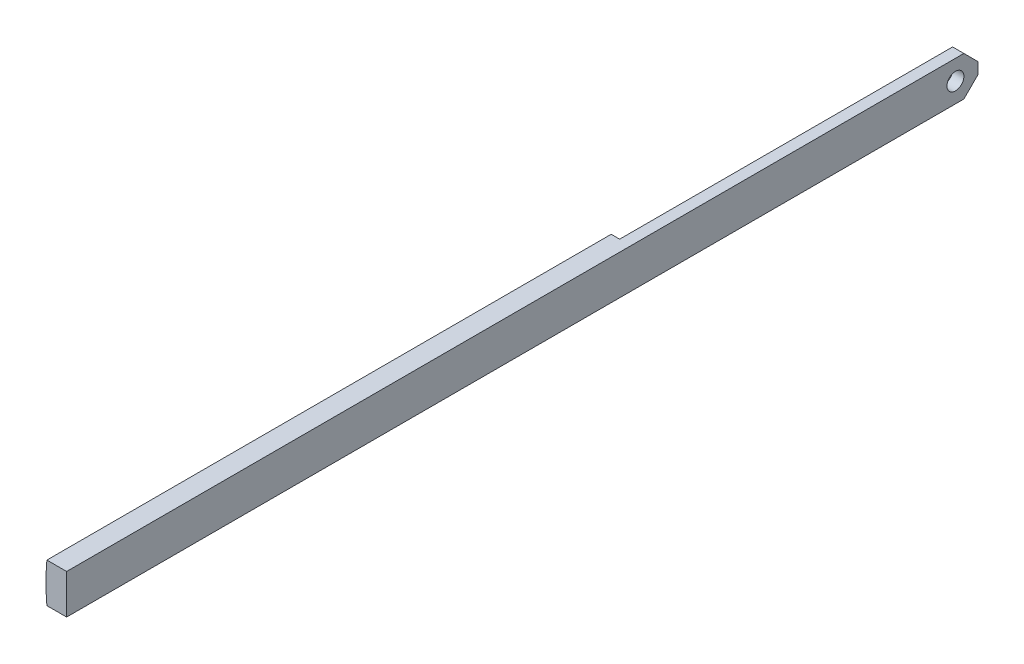
ISO-10303-21;
HEADER;
FILE_DESCRIPTION(('STEP AP214'),'2;1');
FILE_NAME('part.step','',(''),(''),'','','');
FILE_SCHEMA(('AUTOMOTIVE_DESIGN { 1 0 10303 214 1 1 1 1 }'));
ENDSEC;
DATA;
#1=APPLICATION_CONTEXT('core data for automotive mechanical design processes');
#2=APPLICATION_PROTOCOL_DEFINITION('international standard','automotive_design',2000,#1);
#3=PRODUCT_CONTEXT('',#1,'mechanical');
#4=PRODUCT('Part','Part','',(#3));
#5=PRODUCT_RELATED_PRODUCT_CATEGORY('part','',(#4));
#6=PRODUCT_DEFINITION_FORMATION('','',#4);
#7=PRODUCT_DEFINITION_CONTEXT('part definition',#1,'design');
#8=PRODUCT_DEFINITION('design','',#6,#7);
#9=PRODUCT_DEFINITION_SHAPE('','',#8);
#10=(LENGTH_UNIT() NAMED_UNIT(*) SI_UNIT(.MILLI.,.METRE.));
#11=(NAMED_UNIT(*) PLANE_ANGLE_UNIT() SI_UNIT($,.RADIAN.));
#12=(NAMED_UNIT(*) SI_UNIT($,.STERADIAN.) SOLID_ANGLE_UNIT());
#13=UNCERTAINTY_MEASURE_WITH_UNIT(LENGTH_MEASURE(1.E-05),#10,'distance_accuracy_value','');
#14=(GEOMETRIC_REPRESENTATION_CONTEXT(3) GLOBAL_UNCERTAINTY_ASSIGNED_CONTEXT((#13)) GLOBAL_UNIT_ASSIGNED_CONTEXT((#10,
#11,#12)) REPRESENTATION_CONTEXT('',''));
#15=CARTESIAN_POINT('',(0.,0.,0.));
#16=DIRECTION('',(0.,0.,1.));
#17=DIRECTION('',(1.,0.,0.));
#18=AXIS2_PLACEMENT_3D('',#15,#16,#17);
#19=CARTESIAN_POINT('',(72.6491205974634,4.39312657563779,0.));
#20=DIRECTION('',(0.,0.,1.));
#21=DIRECTION('',(1.,0.,0.));
#22=AXIS2_PLACEMENT_3D('',#19,#20,#21);
#23=PLANE('',#22);
#24=DIRECTION('',(0.,1.,0.));
#25=VECTOR('',#24,1.);
#26=CARTESIAN_POINT('',(6.,11.3931265756376,0.));
#27=LINE('',#26,#25);
#28=CARTESIAN_POINT('',(6.,-2.60687342436238,0.));
#29=VERTEX_POINT('',#28);
#30=CARTESIAN_POINT('',(6.,11.3931265756376,0.));
#31=VERTEX_POINT('',#30);
#32=EDGE_CURVE('E127',#29,#31,#27,.T.);
#33=ORIENTED_EDGE('',*,*,#32,.F.);
#34=DIRECTION('',(1.,0.,0.));
#35=VECTOR('',#34,1.);
#36=CARTESIAN_POINT('',(10.,-2.60687342436238,0.));
#37=LINE('',#36,#35);
#38=CARTESIAN_POINT('',(3.00000000000003,-2.60687342436238,0.));
#39=VERTEX_POINT('',#38);
#40=EDGE_CURVE('E132',#39,#29,#37,.T.);
#41=ORIENTED_EDGE('',*,*,#40,.F.);
#42=CARTESIAN_POINT('',(72.6491205974634,4.39312657563779,0.));
#43=DIRECTION('',(0.,0.,1.));
#44=DIRECTION('',(1.,0.,0.));
#45=AXIS2_PLACEMENT_3D('',#42,#43,#44);
#46=CIRCLE('',#45,70.);
#47=CARTESIAN_POINT('',(3.,11.3931265756376,0.));
#48=VERTEX_POINT('',#47);
#49=EDGE_CURVE('E130',#48,#39,#46,.T.);
#50=ORIENTED_EDGE('',*,*,#49,.F.);
#51=DIRECTION('',(-1.,0.,0.));
#52=VECTOR('',#51,1.);
#53=CARTESIAN_POINT('',(3.,11.3931265756376,0.));
#54=LINE('',#53,#52);
#55=EDGE_CURVE('E115',#31,#48,#54,.T.);
#56=ORIENTED_EDGE('',*,*,#55,.F.);
#57=EDGE_LOOP('',(#33,#41,#50,#56));
#58=FACE_BOUND('',#57,.T.);
#59=ADVANCED_FACE('F45',(#58),#23,.F.);
#60=CARTESIAN_POINT('',(72.6491205974634,4.39312657563779,200.));
#61=DIRECTION('',(0.,0.,-1.));
#62=DIRECTION('',(-1.,0.,0.));
#63=AXIS2_PLACEMENT_3D('',#60,#61,#62);
#64=CYLINDRICAL_SURFACE('',#63,70.);
#65=ORIENTED_EDGE('',*,*,#49,.T.);
#66=DIRECTION('',(0.,0.,-1.));
#67=VECTOR('',#66,1.);
#68=CARTESIAN_POINT('',(3.00000000000003,-2.60687342436238,200.));
#69=LINE('',#68,#67);
#70=CARTESIAN_POINT('',(3.00000000000003,-2.60687342436238,200.));
#71=VERTEX_POINT('',#70);
#72=EDGE_CURVE('E164',#71,#39,#69,.T.);
#73=ORIENTED_EDGE('',*,*,#72,.F.);
#74=CARTESIAN_POINT('',(72.6491205974634,4.39312657563779,200.));
#75=DIRECTION('',(0.,0.,1.));
#76=DIRECTION('',(1.,0.,0.));
#77=AXIS2_PLACEMENT_3D('',#74,#75,#76);
#78=CIRCLE('',#77,70.);
#79=CARTESIAN_POINT('',(3.,11.3931265756376,200.));
#80=VERTEX_POINT('',#79);
#81=EDGE_CURVE('E131',#80,#71,#78,.T.);
#82=ORIENTED_EDGE('',*,*,#81,.F.);
#83=DIRECTION('',(0.,0.,-1.));
#84=VECTOR('',#83,1.);
#85=CARTESIAN_POINT('',(3.,11.3931265756376,200.));
#86=LINE('',#85,#84);
#87=EDGE_CURVE('E155',#80,#48,#86,.T.);
#88=ORIENTED_EDGE('',*,*,#87,.T.);
#89=EDGE_LOOP('',(#65,#73,#82,#88));
#90=FACE_BOUND('',#89,.T.);
#91=ADVANCED_FACE('F192',(#90),#64,.T.);
#92=CARTESIAN_POINT('',(10.,-2.60687342436238,200.));
#93=DIRECTION('',(0.,1.,0.));
#94=DIRECTION('',(-1.,0.,0.));
#95=AXIS2_PLACEMENT_3D('',#92,#93,#94);
#96=PLANE('',#95);
#97=DIRECTION('',(0.,0.,1.));
#98=VECTOR('',#97,1.);
#99=CARTESIAN_POINT('',(6.,-2.60687342436238,-123.));
#100=LINE('',#99,#98);
#101=CARTESIAN_POINT('',(6.,-2.60687342436238,-118.));
#102=VERTEX_POINT('',#101);
#103=EDGE_CURVE('E121',#102,#29,#100,.T.);
#104=ORIENTED_EDGE('',*,*,#103,.F.);
#105=DIRECTION('',(1.,0.,0.));
#106=VECTOR('',#105,1.);
#107=CARTESIAN_POINT('',(10.,-2.60687342436238,-118.));
#108=LINE('',#107,#106);
#109=CARTESIAN_POINT('',(10.,-2.60687342436238,-118.));
#110=VERTEX_POINT('',#109);
#111=EDGE_CURVE('E68',#102,#110,#108,.T.);
#112=ORIENTED_EDGE('',*,*,#111,.T.);
#113=DIRECTION('',(0.,0.,-1.));
#114=VECTOR('',#113,1.);
#115=CARTESIAN_POINT('',(10.,-2.60687342436238,200.));
#116=LINE('',#115,#114);
#117=CARTESIAN_POINT('',(10.,-2.60687342436238,200.));
#118=VERTEX_POINT('',#117);
#119=EDGE_CURVE('E162',#118,#110,#116,.T.);
#120=ORIENTED_EDGE('',*,*,#119,.F.);
#121=DIRECTION('',(1.,0.,0.));
#122=VECTOR('',#121,1.);
#123=CARTESIAN_POINT('',(10.,-2.60687342436238,200.));
#124=LINE('',#123,#122);
#125=EDGE_CURVE('E149',#71,#118,#124,.T.);
#126=ORIENTED_EDGE('',*,*,#125,.F.);
#127=ORIENTED_EDGE('',*,*,#72,.T.);
#128=ORIENTED_EDGE('',*,*,#40,.T.);
#129=EDGE_LOOP('',(#104,#112,#120,#126,#127,#128));
#130=FACE_BOUND('',#129,.T.);
#131=ADVANCED_FACE('F188',(#130),#96,.F.);
#132=CARTESIAN_POINT('',(10.,11.3931265756376,200.));
#133=DIRECTION('',(-1.,0.,0.));
#134=DIRECTION('',(0.,0.,1.));
#135=AXIS2_PLACEMENT_3D('',#132,#133,#134);
#136=PLANE('',#135);
#137=CARTESIAN_POINT('',(10.,4.39312657563762,-115.));
#138=DIRECTION('',(1.,0.,0.));
#139=DIRECTION('',(0.,1.,0.));
#140=AXIS2_PLACEMENT_3D('',#137,#138,#139);
#141=CIRCLE('',#140,3.00000000000001);
#142=CARTESIAN_POINT('',(10.,7.39312657563763,-115.));
#143=VERTEX_POINT('',#142);
#144=EDGE_CURVE('E142',#143,#143,#141,.T.);
#145=ORIENTED_EDGE('',*,*,#144,.F.);
#146=EDGE_LOOP('',(#145));
#147=FACE_BOUND('',#146,.T.);
#148=ORIENTED_EDGE('',*,*,#119,.T.);
#149=DIRECTION('',(0.,0.707106781186548,-0.707106781186547));
#150=VECTOR('',#149,1.);
#151=CARTESIAN_POINT('',(10.,2.39312657563765,-123.));
#152=LINE('',#151,#150);
#153=CARTESIAN_POINT('',(9.99999999999999,2.39312657563765,-123.));
#154=VERTEX_POINT('',#153);
#155=EDGE_CURVE('E53',#110,#154,#152,.T.);
#156=ORIENTED_EDGE('',*,*,#155,.T.);
#157=DIRECTION('',(0.,-1.,0.));
#158=VECTOR('',#157,1.);
#159=CARTESIAN_POINT('',(9.99999999999999,11.3931265756376,-123.));
#160=LINE('',#159,#158);
#161=CARTESIAN_POINT('',(9.99999999999999,6.39312657563759,-123.));
#162=VERTEX_POINT('',#161);
#163=EDGE_CURVE('E136',#162,#154,#160,.T.);
#164=ORIENTED_EDGE('',*,*,#163,.F.);
#165=DIRECTION('',(0.,0.707106781186548,0.707106781186548));
#166=VECTOR('',#165,1.);
#167=CARTESIAN_POINT('',(10.,6.39312657563759,-123.));
#168=LINE('',#167,#166);
#169=CARTESIAN_POINT('',(10.,11.3931265756376,-118.));
#170=VERTEX_POINT('',#169);
#171=EDGE_CURVE('E60',#162,#170,#168,.T.);
#172=ORIENTED_EDGE('',*,*,#171,.T.);
#173=DIRECTION('',(0.,0.,-1.));
#174=VECTOR('',#173,1.);
#175=CARTESIAN_POINT('',(10.,11.3931265756376,200.));
#176=LINE('',#175,#174);
#177=CARTESIAN_POINT('',(10.,11.3931265756376,200.));
#178=VERTEX_POINT('',#177);
#179=EDGE_CURVE('E158',#178,#170,#176,.T.);
#180=ORIENTED_EDGE('',*,*,#179,.F.);
#181=DIRECTION('',(0.,1.,0.));
#182=VECTOR('',#181,1.);
#183=CARTESIAN_POINT('',(10.,11.3931265756376,200.));
#184=LINE('',#183,#182);
#185=EDGE_CURVE('E151',#118,#178,#184,.T.);
#186=ORIENTED_EDGE('',*,*,#185,.F.);
#187=EDGE_LOOP('',(#148,#156,#164,#172,#180,#186));
#188=FACE_BOUND('',#187,.T.);
#189=ADVANCED_FACE('F179',(#147,#188),#136,.F.);
#190=CARTESIAN_POINT('',(3.,11.3931265756376,200.));
#191=DIRECTION('',(0.,-1.,0.));
#192=DIRECTION('',(0.,0.,-1.));
#193=AXIS2_PLACEMENT_3D('',#190,#191,#192);
#194=PLANE('',#193);
#195=ORIENTED_EDGE('',*,*,#179,.T.);
#196=DIRECTION('',(-1.,0.,0.));
#197=VECTOR('',#196,1.);
#198=CARTESIAN_POINT('',(6.,11.3931265756376,-118.));
#199=LINE('',#198,#197);
#200=CARTESIAN_POINT('',(6.,11.3931265756376,-118.));
#201=VERTEX_POINT('',#200);
#202=EDGE_CURVE('E12',#170,#201,#199,.T.);
#203=ORIENTED_EDGE('',*,*,#202,.T.);
#204=DIRECTION('',(0.,0.,1.));
#205=VECTOR('',#204,1.);
#206=CARTESIAN_POINT('',(6.,11.3931265756376,-123.));
#207=LINE('',#206,#205);
#208=EDGE_CURVE('E111',#201,#31,#207,.T.);
#209=ORIENTED_EDGE('',*,*,#208,.T.);
#210=ORIENTED_EDGE('',*,*,#55,.T.);
#211=ORIENTED_EDGE('',*,*,#87,.F.);
#212=DIRECTION('',(-1.,0.,0.));
#213=VECTOR('',#212,1.);
#214=CARTESIAN_POINT('',(3.,11.3931265756376,200.));
#215=LINE('',#214,#213);
#216=EDGE_CURVE('E153',#178,#80,#215,.T.);
#217=ORIENTED_EDGE('',*,*,#216,.F.);
#218=EDGE_LOOP('',(#195,#203,#209,#210,#211,#217));
#219=FACE_BOUND('',#218,.T.);
#220=ADVANCED_FACE('F113',(#219),#194,.F.);
#221=CARTESIAN_POINT('',(72.6491205974634,4.39312657563779,200.));
#222=DIRECTION('',(0.,0.,1.));
#223=DIRECTION('',(1.,0.,0.));
#224=AXIS2_PLACEMENT_3D('',#221,#222,#223);
#225=PLANE('',#224);
#226=ORIENTED_EDGE('',*,*,#81,.T.);
#227=ORIENTED_EDGE('',*,*,#125,.T.);
#228=ORIENTED_EDGE('',*,*,#185,.T.);
#229=ORIENTED_EDGE('',*,*,#216,.T.);
#230=EDGE_LOOP('',(#226,#227,#228,#229));
#231=FACE_BOUND('',#230,.T.);
#232=ADVANCED_FACE('F195',(#231),#225,.T.);
#233=CARTESIAN_POINT('',(6.,11.3931265756376,-123.));
#234=DIRECTION('',(1.,0.,0.));
#235=DIRECTION('',(0.,1.,0.));
#236=AXIS2_PLACEMENT_3D('',#233,#234,#235);
#237=PLANE('',#236);
#238=CARTESIAN_POINT('',(6.,4.39312657563762,-115.));
#239=DIRECTION('',(1.,0.,0.));
#240=DIRECTION('',(0.,1.,0.));
#241=AXIS2_PLACEMENT_3D('',#238,#239,#240);
#242=CIRCLE('',#241,3.00000000000001);
#243=CARTESIAN_POINT('',(6.,7.39312657563763,-115.));
#244=VERTEX_POINT('',#243);
#245=EDGE_CURVE('E137',#244,#244,#242,.T.);
#246=ORIENTED_EDGE('',*,*,#245,.T.);
#247=EDGE_LOOP('',(#246));
#248=FACE_BOUND('',#247,.T.);
#249=DIRECTION('',(0.,1.,0.));
#250=VECTOR('',#249,1.);
#251=CARTESIAN_POINT('',(6.,11.3931265756376,-123.));
#252=LINE('',#251,#250);
#253=CARTESIAN_POINT('',(6.,2.39312657563765,-123.));
#254=VERTEX_POINT('',#253);
#255=CARTESIAN_POINT('',(6.,6.39312657563759,-123.));
#256=VERTEX_POINT('',#255);
#257=EDGE_CURVE('E122',#254,#256,#252,.T.);
#258=ORIENTED_EDGE('',*,*,#257,.F.);
#259=DIRECTION('',(0.,-0.707106781186548,0.707106781186547));
#260=VECTOR('',#259,1.);
#261=CARTESIAN_POINT('',(6.,2.39312657563765,-123.));
#262=LINE('',#261,#260);
#263=EDGE_CURVE('E175',#254,#102,#262,.T.);
#264=ORIENTED_EDGE('',*,*,#263,.T.);
#265=ORIENTED_EDGE('',*,*,#103,.T.);
#266=ORIENTED_EDGE('',*,*,#32,.T.);
#267=ORIENTED_EDGE('',*,*,#208,.F.);
#268=DIRECTION('',(0.,-0.707106781186548,-0.707106781186548));
#269=VECTOR('',#268,1.);
#270=CARTESIAN_POINT('',(6.,6.39312657563759,-123.));
#271=LINE('',#270,#269);
#272=EDGE_CURVE('E173',#201,#256,#271,.T.);
#273=ORIENTED_EDGE('',*,*,#272,.T.);
#274=EDGE_LOOP('',(#258,#264,#265,#266,#267,#273));
#275=FACE_BOUND('',#274,.T.);
#276=ADVANCED_FACE('F135',(#248,#275),#237,.F.);
#277=CARTESIAN_POINT('',(0.,0.,-123.));
#278=DIRECTION('',(0.,0.,-1.));
#279=DIRECTION('',(-1.,0.,0.));
#280=AXIS2_PLACEMENT_3D('',#277,#278,#279);
#281=PLANE('',#280);
#282=ORIENTED_EDGE('',*,*,#163,.T.);
#283=DIRECTION('',(-1.,0.,0.));
#284=VECTOR('',#283,1.);
#285=CARTESIAN_POINT('',(6.,2.39312657563765,-123.));
#286=LINE('',#285,#284);
#287=EDGE_CURVE('E170',#154,#254,#286,.T.);
#288=ORIENTED_EDGE('',*,*,#287,.T.);
#289=ORIENTED_EDGE('',*,*,#257,.T.);
#290=DIRECTION('',(1.,0.,0.));
#291=VECTOR('',#290,1.);
#292=CARTESIAN_POINT('',(9.99999999999999,6.39312657563759,-123.));
#293=LINE('',#292,#291);
#294=EDGE_CURVE('E166',#256,#162,#293,.T.);
#295=ORIENTED_EDGE('',*,*,#294,.T.);
#296=EDGE_LOOP('',(#282,#288,#289,#295));
#297=FACE_BOUND('',#296,.T.);
#298=ADVANCED_FACE('F184',(#297),#281,.T.);
#299=CARTESIAN_POINT('',(2.64912059746341,4.39312657563762,-115.));
#300=DIRECTION('',(1.,0.,0.));
#301=DIRECTION('',(0.,1.,0.));
#302=AXIS2_PLACEMENT_3D('',#299,#300,#301);
#303=CYLINDRICAL_SURFACE('',#302,3.00000000000001);
#304=ORIENTED_EDGE('',*,*,#144,.T.);
#305=EDGE_LOOP('',(#304));
#306=FACE_BOUND('',#305,.T.);
#307=ORIENTED_EDGE('',*,*,#245,.F.);
#308=EDGE_LOOP('',(#307));
#309=FACE_BOUND('',#308,.T.);
#310=ADVANCED_FACE('F217',(#306,#309),#303,.F.);
#311=CARTESIAN_POINT('',(0.,2.39312657563765,-123.));
#312=DIRECTION('',(0.,-0.707106781186547,-0.707106781186548));
#313=DIRECTION('',(1.,0.,0.));
#314=AXIS2_PLACEMENT_3D('',#311,#312,#313);
#315=PLANE('',#314);
#316=ORIENTED_EDGE('',*,*,#155,.F.);
#317=ORIENTED_EDGE('',*,*,#111,.F.);
#318=ORIENTED_EDGE('',*,*,#263,.F.);
#319=ORIENTED_EDGE('',*,*,#287,.F.);
#320=EDGE_LOOP('',(#316,#317,#318,#319));
#321=FACE_BOUND('',#320,.T.);
#322=ADVANCED_FACE('F187',(#321),#315,.T.);
#323=CARTESIAN_POINT('',(0.,6.39312657563759,-123.));
#324=DIRECTION('',(0.,0.707106781186547,-0.707106781186547));
#325=DIRECTION('',(-1.,0.,0.));
#326=AXIS2_PLACEMENT_3D('',#323,#324,#325);
#327=PLANE('',#326);
#328=ORIENTED_EDGE('',*,*,#272,.F.);
#329=ORIENTED_EDGE('',*,*,#202,.F.);
#330=ORIENTED_EDGE('',*,*,#171,.F.);
#331=ORIENTED_EDGE('',*,*,#294,.F.);
#332=EDGE_LOOP('',(#328,#329,#330,#331));
#333=FACE_BOUND('',#332,.T.);
#334=ADVANCED_FACE('F47',(#333),#327,.T.);
#335=CLOSED_SHELL('',(#59,#91,#131,#189,#220,#232,#276,#298,#310,#322,#334));
#336=MANIFOLD_SOLID_BREP('B2',#335);
#337=ADVANCED_BREP_SHAPE_REPRESENTATION('',(#18,#336),#14);
#338=SHAPE_DEFINITION_REPRESENTATION(#9,#337);
ENDSEC;
END-ISO-10303-21;
